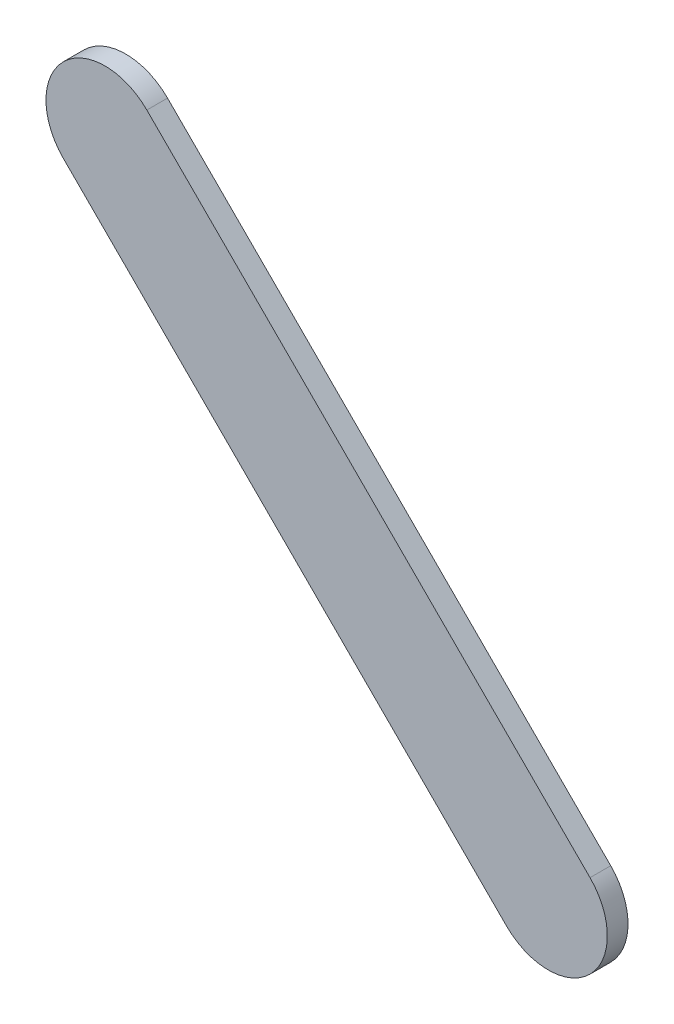
ISO-10303-21;
HEADER;
FILE_DESCRIPTION(('STEP AP214'),'2;1');
FILE_NAME('part.step','',(''),(''),'','','');
FILE_SCHEMA(('AUTOMOTIVE_DESIGN { 1 0 10303 214 1 1 1 1 }'));
ENDSEC;
DATA;
#1=APPLICATION_CONTEXT('core data for automotive mechanical design processes');
#2=APPLICATION_PROTOCOL_DEFINITION('international standard','automotive_design',2000,#1);
#3=PRODUCT_CONTEXT('',#1,'mechanical');
#4=PRODUCT('Part','Part','',(#3));
#5=PRODUCT_RELATED_PRODUCT_CATEGORY('part','',(#4));
#6=PRODUCT_DEFINITION_FORMATION('','',#4);
#7=PRODUCT_DEFINITION_CONTEXT('part definition',#1,'design');
#8=PRODUCT_DEFINITION('design','',#6,#7);
#9=PRODUCT_DEFINITION_SHAPE('','',#8);
#10=(LENGTH_UNIT() NAMED_UNIT(*) SI_UNIT(.MILLI.,.METRE.));
#11=(NAMED_UNIT(*) PLANE_ANGLE_UNIT() SI_UNIT($,.RADIAN.));
#12=(NAMED_UNIT(*) SI_UNIT($,.STERADIAN.) SOLID_ANGLE_UNIT());
#13=UNCERTAINTY_MEASURE_WITH_UNIT(LENGTH_MEASURE(1.E-05),#10,'distance_accuracy_value','');
#14=(GEOMETRIC_REPRESENTATION_CONTEXT(3) GLOBAL_UNCERTAINTY_ASSIGNED_CONTEXT((#13)) GLOBAL_UNIT_ASSIGNED_CONTEXT((#10,
#11,#12)) REPRESENTATION_CONTEXT('',''));
#15=CARTESIAN_POINT('',(0.,0.,0.));
#16=DIRECTION('',(0.,0.,1.));
#17=DIRECTION('',(1.,0.,0.));
#18=AXIS2_PLACEMENT_3D('',#15,#16,#17);
#19=CARTESIAN_POINT('',(78.37071,-118.429289,1.635));
#20=DIRECTION('',(0.,0.,1.));
#21=DIRECTION('',(1.,0.,0.));
#22=AXIS2_PLACEMENT_3D('',#19,#20,#21);
#23=PLANE('',#22);
#24=DIRECTION('',(-0.707106781186548,0.707106781186548,0.));
#25=VECTOR('',#24,1.);
#26=CARTESIAN_POINT('',(78.37071,-118.429289,1.635));
#27=LINE('',#26,#25);
#28=CARTESIAN_POINT('',(78.37071,-118.429289,1.635));
#29=VERTEX_POINT('',#28);
#30=CARTESIAN_POINT('',(77.62071,-117.679289,1.635));
#31=VERTEX_POINT('',#30);
#32=EDGE_CURVE('E72',#29,#31,#27,.T.);
#33=ORIENTED_EDGE('',*,*,#32,.T.);
#34=CARTESIAN_POINT('',(77.5499995,-117.7499995,1.635));
#35=DIRECTION('',(0.,0.,1.));
#36=DIRECTION('',(0.707106781186548,0.707106781186548,0.));
#37=AXIS2_PLACEMENT_3D('',#34,#35,#36);
#38=CIRCLE('',#37,0.09999974810219);
#39=CARTESIAN_POINT('',(77.479289,-117.82071,1.635));
#40=VERTEX_POINT('',#39);
#41=EDGE_CURVE('E70',#31,#40,#38,.T.);
#42=ORIENTED_EDGE('',*,*,#41,.T.);
#43=DIRECTION('',(0.707106781186548,-0.707106781186548,0.));
#44=VECTOR('',#43,1.);
#45=CARTESIAN_POINT('',(77.479289,-117.82071,1.635));
#46=LINE('',#45,#44);
#47=CARTESIAN_POINT('',(78.229289,-118.57071,1.635));
#48=VERTEX_POINT('',#47);
#49=EDGE_CURVE('E20',#40,#48,#46,.T.);
#50=ORIENTED_EDGE('',*,*,#49,.T.);
#51=CARTESIAN_POINT('',(78.2999995,-118.4999995,1.635));
#52=DIRECTION('',(0.,0.,1.));
#53=DIRECTION('',(-0.707106781186548,-0.707106781186548,0.));
#54=AXIS2_PLACEMENT_3D('',#51,#52,#53);
#55=CIRCLE('',#54,0.09999974810219);
#56=EDGE_CURVE('E11',#48,#29,#55,.T.);
#57=ORIENTED_EDGE('',*,*,#56,.T.);
#58=EDGE_LOOP('',(#33,#42,#50,#57));
#59=FACE_BOUND('',#58,.T.);
#60=ADVANCED_FACE('F17',(#59),#23,.T.);
#61=CARTESIAN_POINT('',(78.37071,-118.429289,1.6));
#62=DIRECTION('',(0.,0.,1.));
#63=DIRECTION('',(1.,0.,0.));
#64=AXIS2_PLACEMENT_3D('',#61,#62,#63);
#65=PLANE('',#64);
#66=CARTESIAN_POINT('',(78.2999995,-118.4999995,1.6));
#67=DIRECTION('',(0.,0.,1.));
#68=DIRECTION('',(-0.707106781186548,-0.707106781186548,0.));
#69=AXIS2_PLACEMENT_3D('',#66,#67,#68);
#70=CIRCLE('',#69,0.09999974810219);
#71=CARTESIAN_POINT('',(78.229289,-118.57071,1.6));
#72=VERTEX_POINT('',#71);
#73=CARTESIAN_POINT('',(78.37071,-118.429289,1.6));
#74=VERTEX_POINT('',#73);
#75=EDGE_CURVE('E27',#72,#74,#70,.T.);
#76=ORIENTED_EDGE('',*,*,#75,.F.);
#77=DIRECTION('',(0.707106781186548,-0.707106781186548,0.));
#78=VECTOR('',#77,1.);
#79=CARTESIAN_POINT('',(77.479289,-117.82071,1.6));
#80=LINE('',#79,#78);
#81=CARTESIAN_POINT('',(77.479289,-117.82071,1.6));
#82=VERTEX_POINT('',#81);
#83=EDGE_CURVE('E77',#82,#72,#80,.T.);
#84=ORIENTED_EDGE('',*,*,#83,.F.);
#85=CARTESIAN_POINT('',(77.5499995,-117.7499995,1.6));
#86=DIRECTION('',(0.,0.,1.));
#87=DIRECTION('',(0.707106781186548,0.707106781186548,0.));
#88=AXIS2_PLACEMENT_3D('',#85,#86,#87);
#89=CIRCLE('',#88,0.09999974810219);
#90=CARTESIAN_POINT('',(77.62071,-117.679289,1.6));
#91=VERTEX_POINT('',#90);
#92=EDGE_CURVE('E81',#91,#82,#89,.T.);
#93=ORIENTED_EDGE('',*,*,#92,.F.);
#94=DIRECTION('',(-0.707106781186548,0.707106781186548,0.));
#95=VECTOR('',#94,1.);
#96=CARTESIAN_POINT('',(78.37071,-118.429289,1.6));
#97=LINE('',#96,#95);
#98=EDGE_CURVE('E132',#74,#91,#97,.T.);
#99=ORIENTED_EDGE('',*,*,#98,.F.);
#100=EDGE_LOOP('',(#76,#84,#93,#99));
#101=FACE_BOUND('',#100,.T.);
#102=ADVANCED_FACE('F150',(#101),#65,.F.);
#103=CARTESIAN_POINT('',(78.2999995,-118.4999995,1.6));
#104=DIRECTION('',(0.,0.,-1.));
#105=DIRECTION('',(-0.707106781186548,-0.707106781186548,0.));
#106=AXIS2_PLACEMENT_3D('',#103,#104,#105);
#107=CYLINDRICAL_SURFACE('',#106,0.09999974810219);
#108=ORIENTED_EDGE('',*,*,#75,.T.);
#109=DIRECTION('',(0.,0.,1.));
#110=VECTOR('',#109,1.);
#111=CARTESIAN_POINT('',(78.37071,-118.429289,1.6));
#112=LINE('',#111,#110);
#113=EDGE_CURVE('E88',#74,#29,#112,.T.);
#114=ORIENTED_EDGE('',*,*,#113,.T.);
#115=ORIENTED_EDGE('',*,*,#56,.F.);
#116=DIRECTION('',(0.,0.,1.));
#117=VECTOR('',#116,1.);
#118=CARTESIAN_POINT('',(78.229289,-118.57071,1.6));
#119=LINE('',#118,#117);
#120=EDGE_CURVE('E66',#72,#48,#119,.T.);
#121=ORIENTED_EDGE('',*,*,#120,.F.);
#122=EDGE_LOOP('',(#108,#114,#115,#121));
#123=FACE_BOUND('',#122,.T.);
#124=ADVANCED_FACE('F157',(#123),#107,.T.);
#125=CARTESIAN_POINT('',(77.479289,-117.82071,1.6));
#126=DIRECTION('',(0.707106781186548,0.707106781186548,0.));
#127=DIRECTION('',(0.,0.,-1.));
#128=AXIS2_PLACEMENT_3D('',#125,#126,#127);
#129=PLANE('',#128);
#130=ORIENTED_EDGE('',*,*,#83,.T.);
#131=ORIENTED_EDGE('',*,*,#120,.T.);
#132=ORIENTED_EDGE('',*,*,#49,.F.);
#133=DIRECTION('',(0.,0.,1.));
#134=VECTOR('',#133,1.);
#135=CARTESIAN_POINT('',(77.479289,-117.82071,1.6));
#136=LINE('',#135,#134);
#137=EDGE_CURVE('E64',#82,#40,#136,.T.);
#138=ORIENTED_EDGE('',*,*,#137,.F.);
#139=EDGE_LOOP('',(#130,#131,#132,#138));
#140=FACE_BOUND('',#139,.T.);
#141=ADVANCED_FACE('F62',(#140),#129,.F.);
#142=CARTESIAN_POINT('',(77.5499995,-117.7499995,1.6));
#143=DIRECTION('',(0.,0.,-1.));
#144=DIRECTION('',(0.707106781186548,0.707106781186548,0.));
#145=AXIS2_PLACEMENT_3D('',#142,#143,#144);
#146=CYLINDRICAL_SURFACE('',#145,0.09999974810219);
#147=ORIENTED_EDGE('',*,*,#92,.T.);
#148=ORIENTED_EDGE('',*,*,#137,.T.);
#149=ORIENTED_EDGE('',*,*,#41,.F.);
#150=DIRECTION('',(0.,0.,1.));
#151=VECTOR('',#150,1.);
#152=CARTESIAN_POINT('',(77.62071,-117.679289,1.6));
#153=LINE('',#152,#151);
#154=EDGE_CURVE('E122',#91,#31,#153,.T.);
#155=ORIENTED_EDGE('',*,*,#154,.F.);
#156=EDGE_LOOP('',(#147,#148,#149,#155));
#157=FACE_BOUND('',#156,.T.);
#158=ADVANCED_FACE('F79',(#157),#146,.T.);
#159=CARTESIAN_POINT('',(78.37071,-118.429289,1.6));
#160=DIRECTION('',(-0.707106781186548,-0.707106781186548,0.));
#161=DIRECTION('',(-0.707106781186548,0.707106781186548,0.));
#162=AXIS2_PLACEMENT_3D('',#159,#160,#161);
#163=PLANE('',#162);
#164=ORIENTED_EDGE('',*,*,#98,.T.);
#165=ORIENTED_EDGE('',*,*,#154,.T.);
#166=ORIENTED_EDGE('',*,*,#32,.F.);
#167=ORIENTED_EDGE('',*,*,#113,.F.);
#168=EDGE_LOOP('',(#164,#165,#166,#167));
#169=FACE_BOUND('',#168,.T.);
#170=ADVANCED_FACE('F147',(#169),#163,.F.);
#171=CLOSED_SHELL('',(#60,#102,#124,#141,#158,#170));
#172=MANIFOLD_SOLID_BREP('B1',#171);
#173=ADVANCED_BREP_SHAPE_REPRESENTATION('',(#18,#172),#14);
#174=SHAPE_DEFINITION_REPRESENTATION(#9,#173);
ENDSEC;
END-ISO-10303-21;
